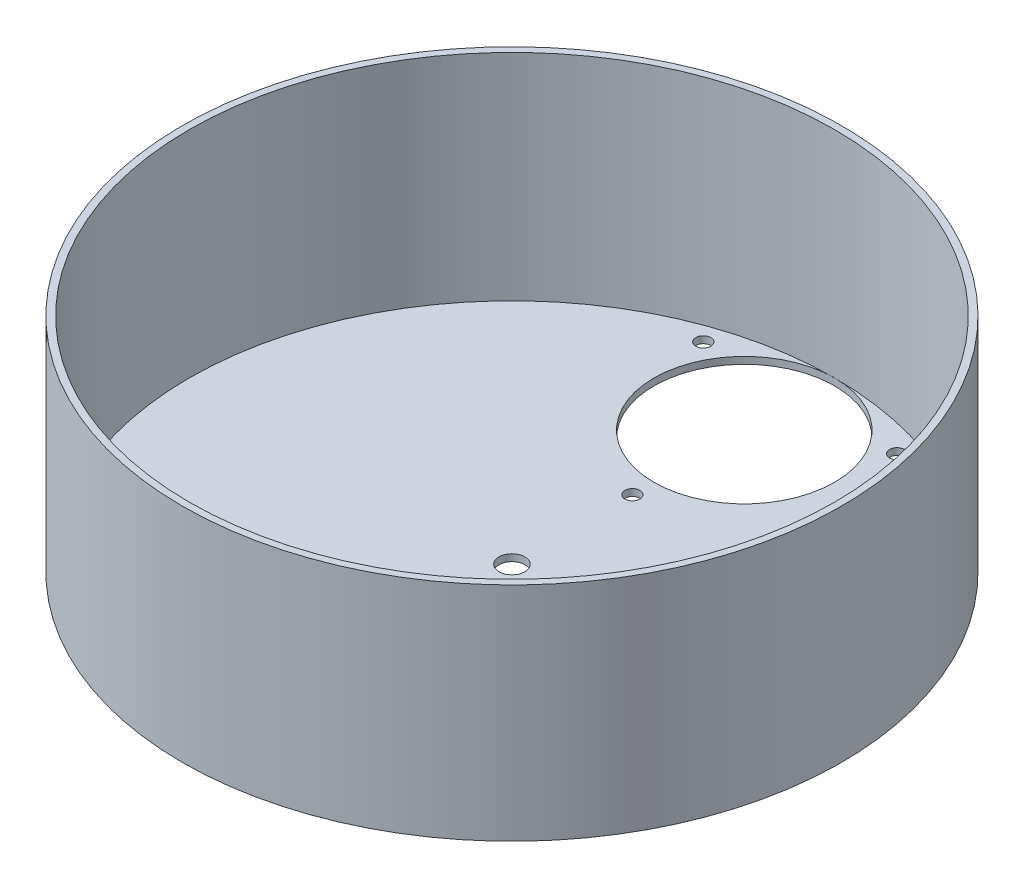
ISO-10303-21;
HEADER;
FILE_DESCRIPTION(('STEP AP214'),'2;1');
FILE_NAME('part.step','',(''),(''),'','','');
FILE_SCHEMA(('AUTOMOTIVE_DESIGN { 1 0 10303 214 1 1 1 1 }'));
ENDSEC;
DATA;
#1=APPLICATION_CONTEXT('core data for automotive mechanical design processes');
#2=APPLICATION_PROTOCOL_DEFINITION('international standard','automotive_design',2000,#1);
#3=PRODUCT_CONTEXT('',#1,'mechanical');
#4=PRODUCT('Part','Part','',(#3));
#5=PRODUCT_RELATED_PRODUCT_CATEGORY('part','',(#4));
#6=PRODUCT_DEFINITION_FORMATION('','',#4);
#7=PRODUCT_DEFINITION_CONTEXT('part definition',#1,'design');
#8=PRODUCT_DEFINITION('design','',#6,#7);
#9=PRODUCT_DEFINITION_SHAPE('','',#8);
#10=(LENGTH_UNIT() NAMED_UNIT(*) SI_UNIT(.MILLI.,.METRE.));
#11=(NAMED_UNIT(*) PLANE_ANGLE_UNIT() SI_UNIT($,.RADIAN.));
#12=(NAMED_UNIT(*) SI_UNIT($,.STERADIAN.) SOLID_ANGLE_UNIT());
#13=UNCERTAINTY_MEASURE_WITH_UNIT(LENGTH_MEASURE(1.E-05),#10,'distance_accuracy_value','');
#14=(GEOMETRIC_REPRESENTATION_CONTEXT(3) GLOBAL_UNCERTAINTY_ASSIGNED_CONTEXT((#13)) GLOBAL_UNIT_ASSIGNED_CONTEXT((#10,
#11,#12)) REPRESENTATION_CONTEXT('',''));
#15=CARTESIAN_POINT('',(0.,0.,0.));
#16=DIRECTION('',(0.,0.,1.));
#17=DIRECTION('',(1.,0.,0.));
#18=AXIS2_PLACEMENT_3D('',#15,#16,#17);
#19=CARTESIAN_POINT('',(0.,50.,0.));
#20=DIRECTION('',(0.,-1.,0.));
#21=DIRECTION('',(0.,0.,-1.));
#22=AXIS2_PLACEMENT_3D('',#19,#20,#21);
#23=CYLINDRICAL_SURFACE('',#22,76.6);
#24=CARTESIAN_POINT('',(0.,50.,0.));
#25=DIRECTION('',(0.,1.,0.));
#26=DIRECTION('',(0.,0.,1.));
#27=AXIS2_PLACEMENT_3D('',#24,#25,#26);
#28=CIRCLE('',#27,76.6);
#29=CARTESIAN_POINT('',(0.,50.,76.6));
#30=VERTEX_POINT('',#29);
#31=EDGE_CURVE('E11',#30,#30,#28,.T.);
#32=ORIENTED_EDGE('',*,*,#31,.F.);
#33=EDGE_LOOP('',(#32));
#34=FACE_BOUND('',#33,.T.);
#35=CARTESIAN_POINT('',(0.,-1.6,0.));
#36=DIRECTION('',(0.,1.,0.));
#37=DIRECTION('',(0.,0.,1.));
#38=AXIS2_PLACEMENT_3D('',#35,#36,#37);
#39=CIRCLE('',#38,76.6);
#40=CARTESIAN_POINT('',(0.,-1.6,76.6));
#41=VERTEX_POINT('',#40);
#42=EDGE_CURVE('E40',#41,#41,#39,.T.);
#43=ORIENTED_EDGE('',*,*,#42,.T.);
#44=EDGE_LOOP('',(#43));
#45=FACE_BOUND('',#44,.T.);
#46=ADVANCED_FACE('F32',(#34,#45),#23,.T.);
#47=CARTESIAN_POINT('',(0.,50.,0.));
#48=DIRECTION('',(0.,1.,0.));
#49=DIRECTION('',(0.,0.,1.));
#50=AXIS2_PLACEMENT_3D('',#47,#48,#49);
#51=PLANE('',#50);
#52=CARTESIAN_POINT('',(0.,50.,0.));
#53=DIRECTION('',(0.,1.,0.));
#54=DIRECTION('',(0.,0.,1.));
#55=AXIS2_PLACEMENT_3D('',#52,#53,#54);
#56=CIRCLE('',#55,75.);
#57=CARTESIAN_POINT('',(0.,50.,75.));
#58=VERTEX_POINT('',#57);
#59=EDGE_CURVE('E58',#58,#58,#56,.T.);
#60=ORIENTED_EDGE('',*,*,#59,.F.);
#61=EDGE_LOOP('',(#60));
#62=FACE_BOUND('',#61,.T.);
#63=ORIENTED_EDGE('',*,*,#31,.T.);
#64=EDGE_LOOP('',(#63));
#65=FACE_BOUND('',#64,.T.);
#66=ADVANCED_FACE('F68',(#62,#65),#51,.T.);
#67=CARTESIAN_POINT('',(0.,-1.6,0.));
#68=DIRECTION('',(0.,1.,0.));
#69=DIRECTION('',(0.,0.,1.));
#70=AXIS2_PLACEMENT_3D('',#67,#68,#69);
#71=PLANE('',#70);
#72=CARTESIAN_POINT('',(0.,-1.6,0.));
#73=DIRECTION('',(0.,1.,0.));
#74=DIRECTION('',(0.,0.,1.));
#75=AXIS2_PLACEMENT_3D('',#72,#73,#74);
#76=CIRCLE('',#75,3.);
#77=CARTESIAN_POINT('',(0.,-1.6,3.));
#78=VERTEX_POINT('',#77);
#79=EDGE_CURVE('E114',#78,#78,#76,.T.);
#80=ORIENTED_EDGE('',*,*,#79,.T.);
#81=EDGE_LOOP('',(#80));
#82=FACE_BOUND('',#81,.T.);
#83=CARTESIAN_POINT('',(22.5166604983955,-1.6,-66.9999999999998));
#84=DIRECTION('',(0.,1.,0.));
#85=DIRECTION('',(0.,0.,1.));
#86=AXIS2_PLACEMENT_3D('',#83,#84,#85);
#87=CIRCLE('',#86,1.75);
#88=CARTESIAN_POINT('',(22.5166604983955,-1.6,-65.2499999999998));
#89=VERTEX_POINT('',#88);
#90=EDGE_CURVE('E118',#89,#89,#87,.T.);
#91=ORIENTED_EDGE('',*,*,#90,.T.);
#92=EDGE_LOOP('',(#91));
#93=FACE_BOUND('',#92,.T.);
#94=CARTESIAN_POINT('',(-22.5166604983953,-1.6,-67.0000000000001));
#95=DIRECTION('',(0.,1.,0.));
#96=DIRECTION('',(0.,0.,1.));
#97=AXIS2_PLACEMENT_3D('',#94,#95,#96);
#98=CIRCLE('',#97,1.75);
#99=CARTESIAN_POINT('',(-22.5166604983953,-1.6,-65.2500000000001));
#100=VERTEX_POINT('',#99);
#101=EDGE_CURVE('E127',#100,#100,#98,.T.);
#102=ORIENTED_EDGE('',*,*,#101,.T.);
#103=EDGE_LOOP('',(#102));
#104=FACE_BOUND('',#103,.T.);
#105=CARTESIAN_POINT('',(0.,-1.6,-28.));
#106=DIRECTION('',(0.,1.,0.));
#107=DIRECTION('',(0.,0.,1.));
#108=AXIS2_PLACEMENT_3D('',#105,#106,#107);
#109=CIRCLE('',#108,1.75);
#110=CARTESIAN_POINT('',(0.,-1.6,-26.25));
#111=VERTEX_POINT('',#110);
#112=EDGE_CURVE('E49',#111,#111,#109,.T.);
#113=ORIENTED_EDGE('',*,*,#112,.T.);
#114=EDGE_LOOP('',(#113));
#115=FACE_BOUND('',#114,.T.);
#116=CARTESIAN_POINT('',(0.,-1.6,-54.));
#117=DIRECTION('',(0.,1.,0.));
#118=DIRECTION('',(0.,0.,1.));
#119=AXIS2_PLACEMENT_3D('',#116,#117,#118);
#120=CIRCLE('',#119,21.);
#121=CARTESIAN_POINT('',(0.,-1.6,-33.));
#122=VERTEX_POINT('',#121);
#123=EDGE_CURVE('E36',#122,#122,#120,.T.);
#124=ORIENTED_EDGE('',*,*,#123,.T.);
#125=EDGE_LOOP('',(#124));
#126=FACE_BOUND('',#125,.T.);
#127=ORIENTED_EDGE('',*,*,#42,.F.);
#128=EDGE_LOOP('',(#127));
#129=FACE_BOUND('',#128,.T.);
#130=ADVANCED_FACE('F34',(#82,#93,#104,#115,#126,#129),#71,.F.);
#131=CARTESIAN_POINT('',(0.,50.,0.));
#132=DIRECTION('',(0.,-1.,0.));
#133=DIRECTION('',(0.,0.,-1.));
#134=AXIS2_PLACEMENT_3D('',#131,#132,#133);
#135=CYLINDRICAL_SURFACE('',#134,75.);
#136=ORIENTED_EDGE('',*,*,#59,.T.);
#137=EDGE_LOOP('',(#136));
#138=FACE_BOUND('',#137,.T.);
#139=CARTESIAN_POINT('',(0.,0.,0.));
#140=DIRECTION('',(0.,1.,0.));
#141=DIRECTION('',(0.,0.,1.));
#142=AXIS2_PLACEMENT_3D('',#139,#140,#141);
#143=CIRCLE('',#142,75.);
#144=CARTESIAN_POINT('',(0.,0.,-75.));
#145=VERTEX_POINT('',#144);
#146=EDGE_CURVE('E52',#145,#145,#143,.T.);
#147=ORIENTED_EDGE('',*,*,#146,.F.);
#148=EDGE_LOOP('',(#147));
#149=FACE_BOUND('',#148,.T.);
#150=ADVANCED_FACE('F67',(#138,#149),#135,.F.);
#151=CARTESIAN_POINT('',(0.,0.,0.));
#152=DIRECTION('',(0.,1.,0.));
#153=DIRECTION('',(0.,0.,1.));
#154=AXIS2_PLACEMENT_3D('',#151,#152,#153);
#155=PLANE('',#154);
#156=CARTESIAN_POINT('',(0.,0.,0.));
#157=DIRECTION('',(0.,1.,0.));
#158=DIRECTION('',(0.,0.,1.));
#159=AXIS2_PLACEMENT_3D('',#156,#157,#158);
#160=CIRCLE('',#159,3.);
#161=CARTESIAN_POINT('',(0.,0.,3.));
#162=VERTEX_POINT('',#161);
#163=EDGE_CURVE('E112',#162,#162,#160,.T.);
#164=ORIENTED_EDGE('',*,*,#163,.F.);
#165=EDGE_LOOP('',(#164));
#166=FACE_BOUND('',#165,.T.);
#167=CARTESIAN_POINT('',(22.5166604983955,0.,-66.9999999999998));
#168=DIRECTION('',(0.,1.,0.));
#169=DIRECTION('',(0.,0.,1.));
#170=AXIS2_PLACEMENT_3D('',#167,#168,#169);
#171=CIRCLE('',#170,1.75);
#172=CARTESIAN_POINT('',(22.5166604983955,0.,-65.2499999999998));
#173=VERTEX_POINT('',#172);
#174=EDGE_CURVE('E115',#173,#173,#171,.T.);
#175=ORIENTED_EDGE('',*,*,#174,.F.);
#176=EDGE_LOOP('',(#175));
#177=FACE_BOUND('',#176,.T.);
#178=CARTESIAN_POINT('',(-22.5166604983953,0.,-67.0000000000001));
#179=DIRECTION('',(0.,1.,0.));
#180=DIRECTION('',(0.,0.,1.));
#181=AXIS2_PLACEMENT_3D('',#178,#179,#180);
#182=CIRCLE('',#181,1.75);
#183=CARTESIAN_POINT('',(-22.5166604983953,0.,-65.2500000000001));
#184=VERTEX_POINT('',#183);
#185=EDGE_CURVE('E124',#184,#184,#182,.T.);
#186=ORIENTED_EDGE('',*,*,#185,.F.);
#187=EDGE_LOOP('',(#186));
#188=FACE_BOUND('',#187,.T.);
#189=CARTESIAN_POINT('',(0.,0.,-28.));
#190=DIRECTION('',(0.,1.,0.));
#191=DIRECTION('',(0.,0.,1.));
#192=AXIS2_PLACEMENT_3D('',#189,#190,#191);
#193=CIRCLE('',#192,1.75);
#194=CARTESIAN_POINT('',(0.,0.,-26.25));
#195=VERTEX_POINT('',#194);
#196=EDGE_CURVE('E54',#195,#195,#193,.T.);
#197=ORIENTED_EDGE('',*,*,#196,.F.);
#198=EDGE_LOOP('',(#197));
#199=FACE_BOUND('',#198,.T.);
#200=ORIENTED_EDGE('',*,*,#146,.T.);
#201=CARTESIAN_POINT('',(0.,0.,-54.));
#202=DIRECTION('',(0.,1.,0.));
#203=DIRECTION('',(0.,0.,1.));
#204=AXIS2_PLACEMENT_3D('',#201,#202,#203);
#205=CIRCLE('',#204,21.);
#206=EDGE_CURVE('E44',#145,#145,#205,.T.);
#207=ORIENTED_EDGE('',*,*,#206,.F.);
#208=EDGE_LOOP('',(#200,#207));
#209=FACE_BOUND('',#208,.T.);
#210=ADVANCED_FACE('F74',(#166,#177,#188,#199,#209),#155,.T.);
#211=CARTESIAN_POINT('',(0.,-50.,-54.));
#212=DIRECTION('',(0.,1.,0.));
#213=DIRECTION('',(0.,0.,1.));
#214=AXIS2_PLACEMENT_3D('',#211,#212,#213);
#215=CYLINDRICAL_SURFACE('',#214,21.);
#216=ORIENTED_EDGE('',*,*,#206,.T.);
#217=EDGE_LOOP('',(#216));
#218=FACE_BOUND('',#217,.T.);
#219=ORIENTED_EDGE('',*,*,#123,.F.);
#220=EDGE_LOOP('',(#219));
#221=FACE_BOUND('',#220,.T.);
#222=ADVANCED_FACE('F45',(#218,#221),#215,.F.);
#223=CARTESIAN_POINT('',(0.,-50.,-28.));
#224=DIRECTION('',(0.,1.,0.));
#225=DIRECTION('',(0.,0.,1.));
#226=AXIS2_PLACEMENT_3D('',#223,#224,#225);
#227=CYLINDRICAL_SURFACE('',#226,1.75);
#228=ORIENTED_EDGE('',*,*,#196,.T.);
#229=EDGE_LOOP('',(#228));
#230=FACE_BOUND('',#229,.T.);
#231=ORIENTED_EDGE('',*,*,#112,.F.);
#232=EDGE_LOOP('',(#231));
#233=FACE_BOUND('',#232,.T.);
#234=ADVANCED_FACE('F92',(#230,#233),#227,.F.);
#235=CARTESIAN_POINT('',(-22.5166604983953,-50.,-67.0000000000001));
#236=DIRECTION('',(0.,1.,0.));
#237=DIRECTION('',(0.,0.,1.));
#238=AXIS2_PLACEMENT_3D('',#235,#236,#237);
#239=CYLINDRICAL_SURFACE('',#238,1.75);
#240=ORIENTED_EDGE('',*,*,#185,.T.);
#241=EDGE_LOOP('',(#240));
#242=FACE_BOUND('',#241,.T.);
#243=ORIENTED_EDGE('',*,*,#101,.F.);
#244=EDGE_LOOP('',(#243));
#245=FACE_BOUND('',#244,.T.);
#246=ADVANCED_FACE('F95',(#242,#245),#239,.F.);
#247=CARTESIAN_POINT('',(22.5166604983955,-50.,-66.9999999999998));
#248=DIRECTION('',(0.,1.,0.));
#249=DIRECTION('',(0.,0.,1.));
#250=AXIS2_PLACEMENT_3D('',#247,#248,#249);
#251=CYLINDRICAL_SURFACE('',#250,1.75);
#252=ORIENTED_EDGE('',*,*,#174,.T.);
#253=EDGE_LOOP('',(#252));
#254=FACE_BOUND('',#253,.T.);
#255=ORIENTED_EDGE('',*,*,#90,.F.);
#256=EDGE_LOOP('',(#255));
#257=FACE_BOUND('',#256,.T.);
#258=ADVANCED_FACE('F99',(#254,#257),#251,.F.);
#259=CARTESIAN_POINT('',(0.,-50.,0.));
#260=DIRECTION('',(0.,1.,0.));
#261=DIRECTION('',(0.,0.,1.));
#262=AXIS2_PLACEMENT_3D('',#259,#260,#261);
#263=CYLINDRICAL_SURFACE('',#262,3.);
#264=ORIENTED_EDGE('',*,*,#163,.T.);
#265=EDGE_LOOP('',(#264));
#266=FACE_BOUND('',#265,.T.);
#267=ORIENTED_EDGE('',*,*,#79,.F.);
#268=EDGE_LOOP('',(#267));
#269=FACE_BOUND('',#268,.T.);
#270=ADVANCED_FACE('F103',(#266,#269),#263,.F.);
#271=CLOSED_SHELL('',(#46,#66,#130,#150,#210,#222,#234,#246,#258,#270));
#272=MANIFOLD_SOLID_BREP('B2',#271);
#273=ADVANCED_BREP_SHAPE_REPRESENTATION('',(#18,#272),#14);
#274=SHAPE_DEFINITION_REPRESENTATION(#9,#273);
ENDSEC;
END-ISO-10303-21;
